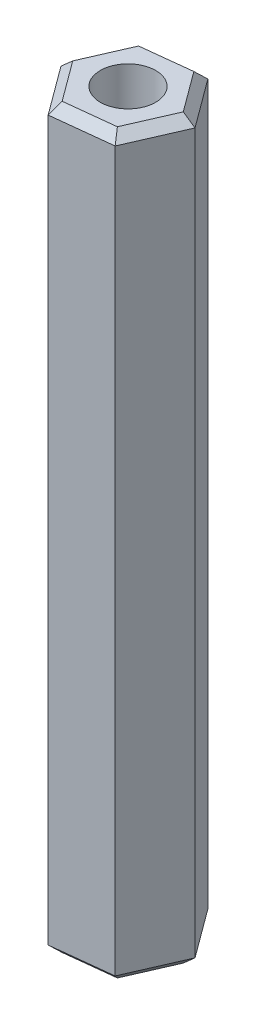
ISO-10303-21;
HEADER;
FILE_DESCRIPTION(('STEP AP214'),'2;1');
FILE_NAME('part.step','',(''),(''),'','','');
FILE_SCHEMA(('AUTOMOTIVE_DESIGN { 1 0 10303 214 1 1 1 1 }'));
ENDSEC;
DATA;
#1=APPLICATION_CONTEXT('core data for automotive mechanical design processes');
#2=APPLICATION_PROTOCOL_DEFINITION('international standard','automotive_design',2000,#1);
#3=PRODUCT_CONTEXT('',#1,'mechanical');
#4=PRODUCT('Part','Part','',(#3));
#5=PRODUCT_RELATED_PRODUCT_CATEGORY('part','',(#4));
#6=PRODUCT_DEFINITION_FORMATION('','',#4);
#7=PRODUCT_DEFINITION_CONTEXT('part definition',#1,'design');
#8=PRODUCT_DEFINITION('design','',#6,#7);
#9=PRODUCT_DEFINITION_SHAPE('','',#8);
#10=(LENGTH_UNIT() NAMED_UNIT(*) SI_UNIT(.MILLI.,.METRE.));
#11=(NAMED_UNIT(*) PLANE_ANGLE_UNIT() SI_UNIT($,.RADIAN.));
#12=(NAMED_UNIT(*) SI_UNIT($,.STERADIAN.) SOLID_ANGLE_UNIT());
#13=UNCERTAINTY_MEASURE_WITH_UNIT(LENGTH_MEASURE(1.E-05),#10,'distance_accuracy_value','');
#14=(GEOMETRIC_REPRESENTATION_CONTEXT(3) GLOBAL_UNCERTAINTY_ASSIGNED_CONTEXT((#13)) GLOBAL_UNIT_ASSIGNED_CONTEXT((#10,
#11,#12)) REPRESENTATION_CONTEXT('',''));
#15=CARTESIAN_POINT('',(0.,0.,0.));
#16=DIRECTION('',(0.,0.,1.));
#17=DIRECTION('',(1.,0.,0.));
#18=AXIS2_PLACEMENT_3D('',#15,#16,#17);
#19=CARTESIAN_POINT('',(0.,40.,0.));
#20=DIRECTION('',(0.,1.,0.));
#21=DIRECTION('',(0.,0.,1.));
#22=AXIS2_PLACEMENT_3D('',#19,#20,#21);
#23=PLANE('',#22);
#24=DIRECTION('',(-0.993787343868683,0.,0.11129562060759));
#25=VECTOR('',#24,1.);
#26=CARTESIAN_POINT('',(-1.89677037135234,40.,-2.15226907201675));
#27=LINE('',#26,#25);
#28=CARTESIAN_POINT('',(1.08679925924675,40.,-2.48640316590732));
#29=VERTEX_POINT('',#28);
#30=CARTESIAN_POINT('',(-1.60988867610242,40.,-2.18439735027546));
#31=VERTEX_POINT('',#30);
#32=EDGE_CURVE('E47',#29,#31,#27,.T.);
#33=ORIENTED_EDGE('',*,*,#32,.T.);
#34=DIRECTION('',(-0.400508837158213,0.,0.916292896053536));
#35=VECTOR('',#34,1.);
#36=CARTESIAN_POINT('',(-2.81230487782223,40.,0.566516790728393));
#37=LINE('',#36,#35);
#38=CARTESIAN_POINT('',(-2.69668793534917,40.,0.302005815631866));
#39=VERTEX_POINT('',#38);
#40=EDGE_CURVE('E11',#31,#39,#37,.T.);
#41=ORIENTED_EDGE('',*,*,#40,.T.);
#42=DIRECTION('',(0.593278506710469,0.,0.804997275445946));
#43=VECTOR('',#42,1.);
#44=CARTESIAN_POINT('',(-0.915534506469895,40.,2.71878586274514));
#45=LINE('',#44,#43);
#46=CARTESIAN_POINT('',(-1.08679925924675,40.,2.48640316590732));
#47=VERTEX_POINT('',#46);
#48=EDGE_CURVE('E160',#39,#47,#45,.T.);
#49=ORIENTED_EDGE('',*,*,#48,.T.);
#50=DIRECTION('',(0.993787343868683,0.,-0.11129562060759));
#51=VECTOR('',#50,1.);
#52=CARTESIAN_POINT('',(1.89677037135234,40.,2.15226907201675));
#53=LINE('',#52,#51);
#54=CARTESIAN_POINT('',(1.60988867610242,40.,2.18439735027546));
#55=VERTEX_POINT('',#54);
#56=EDGE_CURVE('E207',#47,#55,#53,.T.);
#57=ORIENTED_EDGE('',*,*,#56,.T.);
#58=DIRECTION('',(0.400508837158213,0.,-0.916292896053536));
#59=VECTOR('',#58,1.);
#60=CARTESIAN_POINT('',(2.81230487782223,40.,-0.566516790728393));
#61=LINE('',#60,#59);
#62=CARTESIAN_POINT('',(2.69668793534917,40.,-0.302005815631866));
#63=VERTEX_POINT('',#62);
#64=EDGE_CURVE('E205',#55,#63,#61,.T.);
#65=ORIENTED_EDGE('',*,*,#64,.T.);
#66=DIRECTION('',(-0.593278506710469,0.,-0.804997275445946));
#67=VECTOR('',#66,1.);
#68=CARTESIAN_POINT('',(0.915534506469895,40.,-2.71878586274514));
#69=LINE('',#68,#67);
#70=EDGE_CURVE('E58',#63,#29,#69,.T.);
#71=ORIENTED_EDGE('',*,*,#70,.T.);
#72=EDGE_LOOP('',(#33,#41,#49,#57,#65,#71));
#73=FACE_BOUND('',#72,.T.);
#74=CARTESIAN_POINT('',(0.,40.,0.));
#75=DIRECTION('',(0.,1.,0.));
#76=DIRECTION('',(0.,0.,1.));
#77=AXIS2_PLACEMENT_3D('',#74,#75,#76);
#78=CIRCLE('',#77,1.5);
#79=CARTESIAN_POINT('',(0.,40.,1.5));
#80=VERTEX_POINT('',#79);
#81=EDGE_CURVE('E248',#80,#80,#78,.T.);
#82=ORIENTED_EDGE('',*,*,#81,.F.);
#83=EDGE_LOOP('',(#82));
#84=FACE_BOUND('',#83,.T.);
#85=ADVANCED_FACE('F37',(#73,#84),#23,.T.);
#86=CARTESIAN_POINT('',(0.,0.,0.));
#87=DIRECTION('',(0.,1.,0.));
#88=DIRECTION('',(0.,0.,1.));
#89=AXIS2_PLACEMENT_3D('',#86,#87,#88);
#90=PLANE('',#89);
#91=DIRECTION('',(-0.593278506710469,0.,-0.804997275445946));
#92=VECTOR('',#91,1.);
#93=CARTESIAN_POINT('',(-1.89174359729796,0.,1.39420449076959));
#94=LINE('',#93,#92);
#95=CARTESIAN_POINT('',(-1.08679925924675,0.,2.48640316590732));
#96=VERTEX_POINT('',#95);
#97=CARTESIAN_POINT('',(-2.69668793534917,0.,0.302005815631866));
#98=VERTEX_POINT('',#97);
#99=EDGE_CURVE('E189',#96,#98,#94,.T.);
#100=ORIENTED_EDGE('',*,*,#99,.T.);
#101=DIRECTION('',(0.400508837158213,0.,-0.916292896053536));
#102=VECTOR('',#101,1.);
#103=CARTESIAN_POINT('',(-2.15328830572579,0.,-0.941195767321795));
#104=LINE('',#103,#102);
#105=CARTESIAN_POINT('',(-1.3786547911563,0.,-2.71341930046851));
#106=VERTEX_POINT('',#105);
#107=EDGE_CURVE('E146',#98,#106,#104,.T.);
#108=ORIENTED_EDGE('',*,*,#107,.T.);
#109=DIRECTION('',(-0.993787343868683,0.,0.11129562060759));
#110=VECTOR('',#109,1.);
#111=CARTESIAN_POINT('',(1.31803314419287,0.,-3.01542511610038));
#112=LINE('',#111,#110);
#113=CARTESIAN_POINT('',(0.744269753693039,0.,-2.95116855958296));
#114=VERTEX_POINT('',#113);
#115=EDGE_CURVE('E253',#114,#106,#112,.T.);
#116=ORIENTED_EDGE('',*,*,#115,.F.);
#117=DIRECTION('',(0.593278506710469,0.,0.804997275445946));
#118=VECTOR('',#117,1.);
#119=CARTESIAN_POINT('',(1.89174359729796,0.,-1.39420449076959));
#120=LINE('',#119,#118);
#121=CARTESIAN_POINT('',(2.69668793534917,0.,-0.302005815631866));
#122=VERTEX_POINT('',#121);
#123=EDGE_CURVE('E183',#114,#122,#120,.T.);
#124=ORIENTED_EDGE('',*,*,#123,.T.);
#125=DIRECTION('',(-0.400508837158213,0.,0.916292896053536));
#126=VECTOR('',#125,1.);
#127=CARTESIAN_POINT('',(2.15328830572579,0.,0.941195767321795));
#128=LINE('',#127,#126);
#129=CARTESIAN_POINT('',(1.60988867610242,0.,2.18439735027546));
#130=VERTEX_POINT('',#129);
#131=EDGE_CURVE('E185',#122,#130,#128,.T.);
#132=ORIENTED_EDGE('',*,*,#131,.T.);
#133=DIRECTION('',(-0.993787343868683,0.,0.11129562060759));
#134=VECTOR('',#133,1.);
#135=CARTESIAN_POINT('',(0.261544708427835,0.,2.33540025809139));
#136=LINE('',#135,#134);
#137=EDGE_CURVE('E187',#130,#96,#136,.T.);
#138=ORIENTED_EDGE('',*,*,#137,.T.);
#139=EDGE_LOOP('',(#100,#108,#116,#124,#132,#138));
#140=FACE_BOUND('',#139,.T.);
#141=CARTESIAN_POINT('',(0.,0.,0.));
#142=DIRECTION('',(0.,1.,0.));
#143=DIRECTION('',(0.,0.,1.));
#144=AXIS2_PLACEMENT_3D('',#141,#142,#143);
#145=CIRCLE('',#144,1.5);
#146=CARTESIAN_POINT('',(0.,0.,1.5));
#147=VERTEX_POINT('',#146);
#148=EDGE_CURVE('E242',#147,#147,#145,.T.);
#149=ORIENTED_EDGE('',*,*,#148,.T.);
#150=EDGE_LOOP('',(#149));
#151=FACE_BOUND('',#150,.T.);
#152=ADVANCED_FACE('F281',(#140,#151),#90,.F.);
#153=CARTESIAN_POINT('',(1.31803314419287,40.,-3.01542511610038));
#154=DIRECTION('',(0.11129562060759,0.,0.993787343868683));
#155=DIRECTION('',(0.993787343868683,0.,-0.11129562060759));
#156=AXIS2_PLACEMENT_3D('',#153,#154,#155);
#157=PLANE('',#156);
#158=DIRECTION('',(0.,-1.,0.));
#159=VECTOR('',#158,1.);
#160=CARTESIAN_POINT('',(1.31803314419287,40.,-3.01542511610038));
#161=LINE('',#160,#159);
#162=CARTESIAN_POINT('',(1.31803314419287,39.5,-3.01542511610038));
#163=VERTEX_POINT('',#162);
#164=CARTESIAN_POINT('',(1.31803314419287,0.5,-3.01542511610038));
#165=VERTEX_POINT('',#164);
#166=EDGE_CURVE('E258',#163,#165,#161,.T.);
#167=ORIENTED_EDGE('',*,*,#166,.T.);
#168=DIRECTION('',(0.751232619417135,0.654653670707974,-0.0841315811823654));
#169=VECTOR('',#168,1.);
#170=CARTESIAN_POINT('',(2.25244780872116,1.31428571428571,-3.12007150814303));
#171=LINE('',#170,#169);
#172=EDGE_CURVE('E181',#165,#114,#171,.F.);
#173=ORIENTED_EDGE('',*,*,#172,.T.);
#174=ORIENTED_EDGE('',*,*,#115,.T.);
#175=DIRECTION('',(0.751232619417135,-0.654653670707974,-0.0841315811823655));
#176=VECTOR('',#175,1.);
#177=CARTESIAN_POINT('',(-1.95241818165613,0.5,-2.64916274395109));
#178=LINE('',#177,#176);
#179=CARTESIAN_POINT('',(-1.45552450972179,0.066987298107786,-2.70481055425489));
#180=VERTEX_POINT('',#179);
#181=EDGE_CURVE('E179',#106,#180,#178,.F.);
#182=ORIENTED_EDGE('',*,*,#181,.T.);
#183=DIRECTION('',(0.,1.,0.));
#184=VECTOR('',#183,1.);
#185=CARTESIAN_POINT('',(-1.45552450972179,40.,-2.70481055425489));
#186=LINE('',#185,#184);
#187=CARTESIAN_POINT('',(-1.45552450972179,39.5,-2.70481055425489));
#188=VERTEX_POINT('',#187);
#189=EDGE_CURVE('E177',#180,#188,#186,.T.);
#190=ORIENTED_EDGE('',*,*,#189,.T.);
#191=DIRECTION('',(0.993787343868683,0.,-0.11129562060759));
#192=VECTOR('',#191,1.);
#193=CARTESIAN_POINT('',(1.31803314419287,39.5,-3.01542511610038));
#194=LINE('',#193,#192);
#195=EDGE_CURVE('E175',#188,#163,#194,.T.);
#196=ORIENTED_EDGE('',*,*,#195,.T.);
#197=EDGE_LOOP('',(#167,#173,#174,#182,#190,#196));
#198=FACE_BOUND('',#197,.T.);
#199=ADVANCED_FACE('F297',(#198),#157,.F.);
#200=CARTESIAN_POINT('',(-1.95241818165613,40.,-2.64916274395109));
#201=DIRECTION('',(0.916292896053536,0.,0.400508837158213));
#202=DIRECTION('',(0.400508837158213,0.,-0.916292896053536));
#203=AXIS2_PLACEMENT_3D('',#200,#201,#202);
#204=PLANE('',#203);
#205=DIRECTION('',(0.,-1.,0.));
#206=VECTOR('',#205,1.);
#207=CARTESIAN_POINT('',(-2.49952342765441,40.,-1.39748337063477));
#208=LINE('',#207,#206);
#209=CARTESIAN_POINT('',(-2.49952342765441,39.5,-1.39748337063477));
#210=VERTEX_POINT('',#209);
#211=CARTESIAN_POINT('',(-2.49952342765441,0.5,-1.39748337063477));
#212=VERTEX_POINT('',#211);
#213=EDGE_CURVE('E169',#210,#212,#208,.T.);
#214=ORIENTED_EDGE('',*,*,#213,.T.);
#215=DIRECTION('',(-0.400508837158213,0.,0.916292896053536));
#216=VECTOR('',#215,1.);
#217=CARTESIAN_POINT('',(-1.95241818165613,0.5,-2.64916274395109));
#218=LINE('',#217,#216);
#219=CARTESIAN_POINT('',(-3.270451325849,0.5,0.366262372149285));
#220=VERTEX_POINT('',#219);
#221=EDGE_CURVE('E155',#212,#220,#218,.T.);
#222=ORIENTED_EDGE('',*,*,#221,.T.);
#223=DIRECTION('',(0.,-1.,0.));
#224=VECTOR('',#223,1.);
#225=CARTESIAN_POINT('',(-3.270451325849,40.,0.366262372149285));
#226=LINE('',#225,#224);
#227=CARTESIAN_POINT('',(-3.270451325849,39.5,0.366262372149285));
#228=VERTEX_POINT('',#227);
#229=EDGE_CURVE('E137',#228,#220,#226,.T.);
#230=ORIENTED_EDGE('',*,*,#229,.F.);
#231=DIRECTION('',(0.400508837158213,0.,-0.916292896053536));
#232=VECTOR('',#231,1.);
#233=CARTESIAN_POINT('',(-1.95241818165613,39.5,-2.64916274395109));
#234=LINE('',#233,#232);
#235=EDGE_CURVE('E152',#228,#210,#234,.T.);
#236=ORIENTED_EDGE('',*,*,#235,.T.);
#237=EDGE_LOOP('',(#214,#222,#230,#236));
#238=FACE_BOUND('',#237,.T.);
#239=ADVANCED_FACE('F150',(#238),#204,.F.);
#240=CARTESIAN_POINT('',(-3.270451325849,40.,0.366262372149285));
#241=DIRECTION('',(0.804997275445946,0.,-0.593278506710469));
#242=DIRECTION('',(-0.593278506710469,0.,-0.804997275445946));
#243=AXIS2_PLACEMENT_3D('',#240,#241,#242);
#244=PLANE('',#243);
#245=ORIENTED_EDGE('',*,*,#229,.T.);
#246=DIRECTION('',(0.593278506710469,0.,0.804997275445946));
#247=VECTOR('',#246,1.);
#248=CARTESIAN_POINT('',(-3.270451325849,0.5,0.366262372149285));
#249=LINE('',#248,#247);
#250=CARTESIAN_POINT('',(-1.31803314419287,0.5,3.01542511610038));
#251=VERTEX_POINT('',#250);
#252=EDGE_CURVE('E145',#220,#251,#249,.T.);
#253=ORIENTED_EDGE('',*,*,#252,.T.);
#254=DIRECTION('',(0.,-1.,0.));
#255=VECTOR('',#254,1.);
#256=CARTESIAN_POINT('',(-1.31803314419287,40.,3.01542511610038));
#257=LINE('',#256,#255);
#258=CARTESIAN_POINT('',(-1.31803314419287,39.5,3.01542511610038));
#259=VERTEX_POINT('',#258);
#260=EDGE_CURVE('E140',#259,#251,#257,.T.);
#261=ORIENTED_EDGE('',*,*,#260,.F.);
#262=DIRECTION('',(-0.593278506710469,0.,-0.804997275445946));
#263=VECTOR('',#262,1.);
#264=CARTESIAN_POINT('',(-3.270451325849,39.5,0.366262372149285));
#265=LINE('',#264,#263);
#266=EDGE_CURVE('E134',#259,#228,#265,.T.);
#267=ORIENTED_EDGE('',*,*,#266,.T.);
#268=EDGE_LOOP('',(#245,#253,#261,#267));
#269=FACE_BOUND('',#268,.T.);
#270=ADVANCED_FACE('F136',(#269),#244,.F.);
#271=CARTESIAN_POINT('',(-1.31803314419287,40.,3.01542511610038));
#272=DIRECTION('',(-0.11129562060759,0.,-0.993787343868683));
#273=DIRECTION('',(-0.993787343868683,0.,0.11129562060759));
#274=AXIS2_PLACEMENT_3D('',#271,#272,#273);
#275=PLANE('',#274);
#276=ORIENTED_EDGE('',*,*,#260,.T.);
#277=DIRECTION('',(0.993787343868683,0.,-0.11129562060759));
#278=VECTOR('',#277,1.);
#279=CARTESIAN_POINT('',(-1.31803314419287,0.5,3.01542511610038));
#280=LINE('',#279,#278);
#281=CARTESIAN_POINT('',(1.95241818165613,0.5,2.64916274395109));
#282=VERTEX_POINT('',#281);
#283=EDGE_CURVE('E195',#251,#282,#280,.T.);
#284=ORIENTED_EDGE('',*,*,#283,.T.);
#285=DIRECTION('',(0.,-1.,0.));
#286=VECTOR('',#285,1.);
#287=CARTESIAN_POINT('',(1.95241818165613,40.,2.64916274395109));
#288=LINE('',#287,#286);
#289=CARTESIAN_POINT('',(1.95241818165613,39.5,2.64916274395109));
#290=VERTEX_POINT('',#289);
#291=EDGE_CURVE('E264',#290,#282,#288,.T.);
#292=ORIENTED_EDGE('',*,*,#291,.F.);
#293=DIRECTION('',(-0.993787343868683,0.,0.11129562060759));
#294=VECTOR('',#293,1.);
#295=CARTESIAN_POINT('',(-1.31803314419287,39.5,3.01542511610038));
#296=LINE('',#295,#294);
#297=EDGE_CURVE('E193',#290,#259,#296,.T.);
#298=ORIENTED_EDGE('',*,*,#297,.T.);
#299=EDGE_LOOP('',(#276,#284,#292,#298));
#300=FACE_BOUND('',#299,.T.);
#301=ADVANCED_FACE('F268',(#300),#275,.F.);
#302=CARTESIAN_POINT('',(1.95241818165613,40.,2.64916274395109));
#303=DIRECTION('',(-0.916292896053536,0.,-0.400508837158213));
#304=DIRECTION('',(-0.400508837158213,0.,0.916292896053536));
#305=AXIS2_PLACEMENT_3D('',#302,#303,#304);
#306=PLANE('',#305);
#307=ORIENTED_EDGE('',*,*,#291,.T.);
#308=DIRECTION('',(0.400508837158213,0.,-0.916292896053536));
#309=VECTOR('',#308,1.);
#310=CARTESIAN_POINT('',(1.95241818165613,0.5,2.64916274395109));
#311=LINE('',#310,#309);
#312=CARTESIAN_POINT('',(3.270451325849,0.5,-0.366262372149285));
#313=VERTEX_POINT('',#312);
#314=EDGE_CURVE('E199',#282,#313,#311,.T.);
#315=ORIENTED_EDGE('',*,*,#314,.T.);
#316=DIRECTION('',(0.,-1.,0.));
#317=VECTOR('',#316,1.);
#318=CARTESIAN_POINT('',(3.270451325849,40.,-0.366262372149285));
#319=LINE('',#318,#317);
#320=CARTESIAN_POINT('',(3.270451325849,39.5,-0.366262372149285));
#321=VERTEX_POINT('',#320);
#322=EDGE_CURVE('E261',#321,#313,#319,.T.);
#323=ORIENTED_EDGE('',*,*,#322,.F.);
#324=DIRECTION('',(-0.400508837158213,0.,0.916292896053536));
#325=VECTOR('',#324,1.);
#326=CARTESIAN_POINT('',(1.95241818165613,39.5,2.64916274395109));
#327=LINE('',#326,#325);
#328=EDGE_CURVE('E197',#321,#290,#327,.T.);
#329=ORIENTED_EDGE('',*,*,#328,.T.);
#330=EDGE_LOOP('',(#307,#315,#323,#329));
#331=FACE_BOUND('',#330,.T.);
#332=ADVANCED_FACE('F287',(#331),#306,.F.);
#333=CARTESIAN_POINT('',(3.270451325849,40.,-0.366262372149285));
#334=DIRECTION('',(-0.804997275445946,0.,0.593278506710469));
#335=DIRECTION('',(0.593278506710469,0.,0.804997275445946));
#336=AXIS2_PLACEMENT_3D('',#333,#334,#335);
#337=PLANE('',#336);
#338=ORIENTED_EDGE('',*,*,#322,.T.);
#339=DIRECTION('',(-0.593278506710469,0.,-0.804997275445946));
#340=VECTOR('',#339,1.);
#341=CARTESIAN_POINT('',(3.270451325849,0.5,-0.366262372149285));
#342=LINE('',#341,#340);
#343=EDGE_CURVE('E203',#313,#165,#342,.T.);
#344=ORIENTED_EDGE('',*,*,#343,.T.);
#345=ORIENTED_EDGE('',*,*,#166,.F.);
#346=DIRECTION('',(0.593278506710469,0.,0.804997275445946));
#347=VECTOR('',#346,1.);
#348=CARTESIAN_POINT('',(3.270451325849,39.5,-0.366262372149285));
#349=LINE('',#348,#347);
#350=EDGE_CURVE('E201',#163,#321,#349,.T.);
#351=ORIENTED_EDGE('',*,*,#350,.T.);
#352=EDGE_LOOP('',(#338,#344,#345,#351));
#353=FACE_BOUND('',#352,.T.);
#354=ADVANCED_FACE('F291',(#353),#337,.F.);
#355=CARTESIAN_POINT('',(0.,40.,0.));
#356=DIRECTION('',(0.,-1.,0.));
#357=DIRECTION('',(0.,0.,-1.));
#358=AXIS2_PLACEMENT_3D('',#355,#356,#357);
#359=CYLINDRICAL_SURFACE('',#358,1.5);
#360=ORIENTED_EDGE('',*,*,#81,.T.);
#361=EDGE_LOOP('',(#360));
#362=FACE_BOUND('',#361,.T.);
#363=ORIENTED_EDGE('',*,*,#148,.F.);
#364=EDGE_LOOP('',(#363));
#365=FACE_BOUND('',#364,.T.);
#366=ADVANCED_FACE('F332',(#362,#365),#359,.F.);
#367=CARTESIAN_POINT('',(3.270451325849,0.5,-0.366262372149285));
#368=DIRECTION('',(-0.569219032304521,0.70710678118655,0.4195112552272));
#369=DIRECTION('',(-0.593278506710469,0.,-0.804997275445946));
#370=AXIS2_PLACEMENT_3D('',#367,#368,#369);
#371=PLANE('',#370);
#372=ORIENTED_EDGE('',*,*,#172,.F.);
#373=ORIENTED_EDGE('',*,*,#343,.F.);
#374=DIRECTION('',(-0.751232619417135,-0.654653670707974,0.0841315811823651));
#375=VECTOR('',#374,1.);
#376=CARTESIAN_POINT('',(3.270451325849,0.5,-0.366262372149285));
#377=LINE('',#376,#375);
#378=EDGE_CURVE('E235',#122,#313,#377,.F.);
#379=ORIENTED_EDGE('',*,*,#378,.F.);
#380=ORIENTED_EDGE('',*,*,#123,.F.);
#381=EDGE_LOOP('',(#372,#373,#379,#380));
#382=FACE_BOUND('',#381,.T.);
#383=ADVANCED_FACE('F40',(#382),#371,.F.);
#384=CARTESIAN_POINT('',(2.1532883057258,40.,0.941195767321795));
#385=DIRECTION('',(0.647916920352518,0.707106781186545,0.283202514679712));
#386=DIRECTION('',(-0.400508837158213,0.,0.916292896053536));
#387=AXIS2_PLACEMENT_3D('',#384,#385,#386);
#388=PLANE('',#387);
#389=DIRECTION('',(-0.75123261941713,0.65465367070798,0.0841315811823649));
#390=VECTOR('',#389,1.);
#391=CARTESIAN_POINT('',(2.31144680172786,40.3357142857143,-0.258862127684457));
#392=LINE('',#391,#390);
#393=EDGE_CURVE('E233',#63,#321,#392,.F.);
#394=ORIENTED_EDGE('',*,*,#393,.F.);
#395=ORIENTED_EDGE('',*,*,#64,.F.);
#396=DIRECTION('',(0.448476396273046,-0.65465367070798,0.608520741975579));
#397=VECTOR('',#396,1.);
#398=CARTESIAN_POINT('',(1.37990457951636,40.3357142857143,1.87234058595039));
#399=LINE('',#398,#397);
#400=EDGE_CURVE('E42',#290,#55,#399,.F.);
#401=ORIENTED_EDGE('',*,*,#400,.F.);
#402=ORIENTED_EDGE('',*,*,#328,.F.);
#403=EDGE_LOOP('',(#394,#395,#401,#402));
#404=FACE_BOUND('',#403,.T.);
#405=ADVANCED_FACE('F388',(#404),#388,.T.);
#406=CARTESIAN_POINT('',(0.261544708427835,40.,2.33540025809139));
#407=DIRECTION('',(0.0786978880479925,0.707106781186545,0.702713769906916));
#408=DIRECTION('',(-0.993787343868683,0.,0.11129562060759));
#409=AXIS2_PLACEMENT_3D('',#406,#407,#408);
#410=PLANE('',#409);
#411=ORIENTED_EDGE('',*,*,#400,.T.);
#412=ORIENTED_EDGE('',*,*,#56,.F.);
#413=DIRECTION('',(-0.302756223144085,-0.65465367070798,0.692652323157944));
#414=VECTOR('',#413,1.);
#415=CARTESIAN_POINT('',(-0.931542222211501,40.3357142857143,2.13120271363485));
#416=LINE('',#415,#414);
#417=EDGE_CURVE('E231',#259,#47,#416,.F.);
#418=ORIENTED_EDGE('',*,*,#417,.F.);
#419=ORIENTED_EDGE('',*,*,#297,.F.);
#420=EDGE_LOOP('',(#411,#412,#418,#419));
#421=FACE_BOUND('',#420,.T.);
#422=ADVANCED_FACE('F385',(#421),#410,.T.);
#423=CARTESIAN_POINT('',(1.95241818165613,0.5,2.64916274395109));
#424=DIRECTION('',(-0.647916920352513,0.70710678118655,-0.28320251467971));
#425=DIRECTION('',(0.400508837158213,0.,-0.916292896053536));
#426=AXIS2_PLACEMENT_3D('',#423,#424,#425);
#427=PLANE('',#426);
#428=ORIENTED_EDGE('',*,*,#378,.T.);
#429=ORIENTED_EDGE('',*,*,#314,.F.);
#430=DIRECTION('',(-0.44847639627305,-0.654653670707974,-0.608520741975583));
#431=VECTOR('',#430,1.);
#432=CARTESIAN_POINT('',(1.95241818165613,0.5,2.64916274395109));
#433=LINE('',#432,#431);
#434=EDGE_CURVE('E228',#130,#282,#433,.F.);
#435=ORIENTED_EDGE('',*,*,#434,.F.);
#436=ORIENTED_EDGE('',*,*,#131,.F.);
#437=EDGE_LOOP('',(#428,#429,#435,#436));
#438=FACE_BOUND('',#437,.T.);
#439=ADVANCED_FACE('F284',(#438),#427,.F.);
#440=CARTESIAN_POINT('',(1.89174359729796,40.,-1.39420449076959));
#441=DIRECTION('',(0.569219032304526,0.707106781186545,-0.419511255227203));
#442=DIRECTION('',(0.593278506710469,0.,0.804997275445946));
#443=AXIS2_PLACEMENT_3D('',#440,#441,#442);
#444=PLANE('',#443);
#445=ORIENTED_EDGE('',*,*,#393,.T.);
#446=ORIENTED_EDGE('',*,*,#350,.F.);
#447=DIRECTION('',(-0.302756223144084,0.65465367070798,0.692652323157944));
#448=VECTOR('',#447,1.);
#449=CARTESIAN_POINT('',(0.931542222211502,40.3357142857143,-2.13120271363485));
#450=LINE('',#449,#448);
#451=EDGE_CURVE('E162',#29,#163,#450,.F.);
#452=ORIENTED_EDGE('',*,*,#451,.F.);
#453=ORIENTED_EDGE('',*,*,#70,.F.);
#454=EDGE_LOOP('',(#445,#446,#452,#453));
#455=FACE_BOUND('',#454,.T.);
#456=ADVANCED_FACE('F301',(#455),#444,.T.);
#457=CARTESIAN_POINT('',(-1.89174359729796,40.,1.39420449076959));
#458=DIRECTION('',(-0.569219032304525,0.707106781186545,0.419511255227203));
#459=DIRECTION('',(-0.593278506710469,0.,-0.804997275445946));
#460=AXIS2_PLACEMENT_3D('',#457,#458,#459);
#461=PLANE('',#460);
#462=ORIENTED_EDGE('',*,*,#417,.T.);
#463=ORIENTED_EDGE('',*,*,#48,.F.);
#464=DIRECTION('',(-0.75123261941713,-0.65465367070798,0.0841315811823646));
#465=VECTOR('',#464,1.);
#466=CARTESIAN_POINT('',(-2.31144680172786,40.3357142857143,0.258862127684457));
#467=LINE('',#466,#465);
#468=EDGE_CURVE('E158',#228,#39,#467,.F.);
#469=ORIENTED_EDGE('',*,*,#468,.F.);
#470=ORIENTED_EDGE('',*,*,#266,.F.);
#471=EDGE_LOOP('',(#462,#463,#469,#470));
#472=FACE_BOUND('',#471,.T.);
#473=ADVANCED_FACE('F159',(#472),#461,.T.);
#474=CARTESIAN_POINT('',(-1.31803314419287,0.5,3.01542511610038));
#475=DIRECTION('',(-0.0786978880479919,0.70710678118655,-0.70271376990691));
#476=DIRECTION('',(0.993787343868683,0.,-0.11129562060759));
#477=AXIS2_PLACEMENT_3D('',#474,#475,#476);
#478=PLANE('',#477);
#479=ORIENTED_EDGE('',*,*,#434,.T.);
#480=ORIENTED_EDGE('',*,*,#283,.F.);
#481=DIRECTION('',(0.302756223144086,-0.654653670707974,-0.692652323157949));
#482=VECTOR('',#481,1.);
#483=CARTESIAN_POINT('',(-1.31803314419287,0.5,3.01542511610038));
#484=LINE('',#483,#482);
#485=EDGE_CURVE('E163',#96,#251,#484,.F.);
#486=ORIENTED_EDGE('',*,*,#485,.F.);
#487=ORIENTED_EDGE('',*,*,#137,.F.);
#488=EDGE_LOOP('',(#479,#480,#486,#487));
#489=FACE_BOUND('',#488,.T.);
#490=ADVANCED_FACE('F272',(#489),#478,.F.);
#491=CARTESIAN_POINT('',(-0.261544708427834,40.,-2.33540025809139));
#492=DIRECTION('',(-0.0786978880479923,0.707106781186545,-0.702713769906916));
#493=DIRECTION('',(0.993787343868683,0.,-0.11129562060759));
#494=AXIS2_PLACEMENT_3D('',#491,#492,#493);
#495=PLANE('',#494);
#496=ORIENTED_EDGE('',*,*,#451,.T.);
#497=ORIENTED_EDGE('',*,*,#195,.F.);
#498=DIRECTION('',(0.209162810706721,-0.677497944020814,-0.705157751474686));
#499=VECTOR('',#498,1.);
#500=CARTESIAN_POINT('',(-1.45552450972179,39.5,-2.70481055425489));
#501=LINE('',#500,#499);
#502=EDGE_CURVE('E221',#31,#188,#501,.T.);
#503=ORIENTED_EDGE('',*,*,#502,.F.);
#504=ORIENTED_EDGE('',*,*,#32,.F.);
#505=EDGE_LOOP('',(#496,#497,#503,#504));
#506=FACE_BOUND('',#505,.T.);
#507=ADVANCED_FACE('F304',(#506),#495,.T.);
#508=CARTESIAN_POINT('',(-2.1532883057258,40.,-0.941195767321795));
#509=DIRECTION('',(-0.647916920352518,0.707106781186545,-0.283202514679712));
#510=DIRECTION('',(0.400508837158213,0.,-0.916292896053536));
#511=AXIS2_PLACEMENT_3D('',#508,#509,#510);
#512=PLANE('',#511);
#513=ORIENTED_EDGE('',*,*,#468,.T.);
#514=ORIENTED_EDGE('',*,*,#40,.F.);
#515=DIRECTION('',(0.690348348990002,0.387995381130113,-0.610637978894595));
#516=VECTOR('',#515,1.);
#517=CARTESIAN_POINT('',(-1.45086595092067,40.0893752885127,-2.32505867820557));
#518=LINE('',#517,#516);
#519=EDGE_CURVE('E167',#210,#31,#518,.T.);
#520=ORIENTED_EDGE('',*,*,#519,.F.);
#521=ORIENTED_EDGE('',*,*,#235,.F.);
#522=EDGE_LOOP('',(#513,#514,#520,#521));
#523=FACE_BOUND('',#522,.T.);
#524=ADVANCED_FACE('F165',(#523),#512,.T.);
#525=CARTESIAN_POINT('',(-3.270451325849,0.5,0.366262372149285));
#526=DIRECTION('',(0.569219032304521,0.70710678118655,-0.4195112552272));
#527=DIRECTION('',(0.593278506710469,0.,0.804997275445946));
#528=AXIS2_PLACEMENT_3D('',#525,#526,#527);
#529=PLANE('',#528);
#530=ORIENTED_EDGE('',*,*,#485,.T.);
#531=ORIENTED_EDGE('',*,*,#252,.F.);
#532=DIRECTION('',(0.751232619417135,-0.654653670707974,-0.0841315811823651));
#533=VECTOR('',#532,1.);
#534=CARTESIAN_POINT('',(-3.270451325849,0.5,0.366262372149285));
#535=LINE('',#534,#533);
#536=EDGE_CURVE('E217',#98,#220,#535,.F.);
#537=ORIENTED_EDGE('',*,*,#536,.F.);
#538=ORIENTED_EDGE('',*,*,#99,.F.);
#539=EDGE_LOOP('',(#530,#531,#537,#538));
#540=FACE_BOUND('',#539,.T.);
#541=ADVANCED_FACE('F277',(#540),#529,.F.);
#542=CARTESIAN_POINT('',(-1.45552450972179,39.5,-2.70481055425489));
#543=DIRECTION('',(-0.723446619131241,0.377964473009234,-0.577726446002283));
#544=DIRECTION('',(-0.624015881858923,0.,0.781411657954904));
#545=AXIS2_PLACEMENT_3D('',#542,#543,#544);
#546=PLANE('',#545);
#547=ORIENTED_EDGE('',*,*,#519,.T.);
#548=ORIENTED_EDGE('',*,*,#502,.T.);
#549=DIRECTION('',(0.624015881858923,0.,-0.781411657954904));
#550=VECTOR('',#549,1.);
#551=CARTESIAN_POINT('',(-1.45552450972179,39.5,-2.70481055425489));
#552=LINE('',#551,#550);
#553=EDGE_CURVE('E214',#210,#188,#552,.T.);
#554=ORIENTED_EDGE('',*,*,#553,.F.);
#555=EDGE_LOOP('',(#547,#548,#554));
#556=FACE_BOUND('',#555,.T.);
#557=ADVANCED_FACE('F307',(#556),#546,.T.);
#558=CARTESIAN_POINT('',(-1.95241818165613,0.5,-2.64916274395109));
#559=DIRECTION('',(0.647916920352513,0.707106781186551,0.28320251467971));
#560=DIRECTION('',(-0.400508837158213,0.,0.916292896053536));
#561=AXIS2_PLACEMENT_3D('',#558,#559,#560);
#562=PLANE('',#561);
#563=ORIENTED_EDGE('',*,*,#536,.T.);
#564=ORIENTED_EDGE('',*,*,#221,.F.);
#565=DIRECTION('',(0.604109991066214,-0.250562807085732,-0.756484896345788));
#566=VECTOR('',#565,1.);
#567=CARTESIAN_POINT('',(-1.72784040145762,0.179934005257853,-2.36380831595469));
#568=LINE('',#567,#566);
#569=EDGE_CURVE('E212',#180,#212,#568,.F.);
#570=ORIENTED_EDGE('',*,*,#569,.F.);
#571=ORIENTED_EDGE('',*,*,#181,.F.);
#572=ORIENTED_EDGE('',*,*,#107,.F.);
#573=EDGE_LOOP('',(#563,#564,#570,#571,#572));
#574=FACE_BOUND('',#573,.T.);
#575=ADVANCED_FACE('F314',(#574),#562,.F.);
#576=CARTESIAN_POINT('',(-2.49952342765441,40.,-1.39748337063477));
#577=DIRECTION('',(0.781411657954903,0.,0.624015881858923));
#578=DIRECTION('',(0.,-1.,0.));
#579=AXIS2_PLACEMENT_3D('',#576,#577,#578);
#580=PLANE('',#579);
#581=ORIENTED_EDGE('',*,*,#553,.T.);
#582=ORIENTED_EDGE('',*,*,#189,.F.);
#583=ORIENTED_EDGE('',*,*,#569,.T.);
#584=ORIENTED_EDGE('',*,*,#213,.F.);
#585=EDGE_LOOP('',(#581,#582,#583,#584));
#586=FACE_BOUND('',#585,.T.);
#587=ADVANCED_FACE('F311',(#586),#580,.F.);
#588=CLOSED_SHELL('',(#85,#152,#199,#239,#270,#301,#332,#354,#366,#383,#405,#422,#439,#456,#473,
#490,#507,#524,#541,#557,#575,#587));
#589=MANIFOLD_SOLID_BREP('B2',#588);
#590=ADVANCED_BREP_SHAPE_REPRESENTATION('',(#18,#589),#14);
#591=SHAPE_DEFINITION_REPRESENTATION(#9,#590);
ENDSEC;
END-ISO-10303-21;
